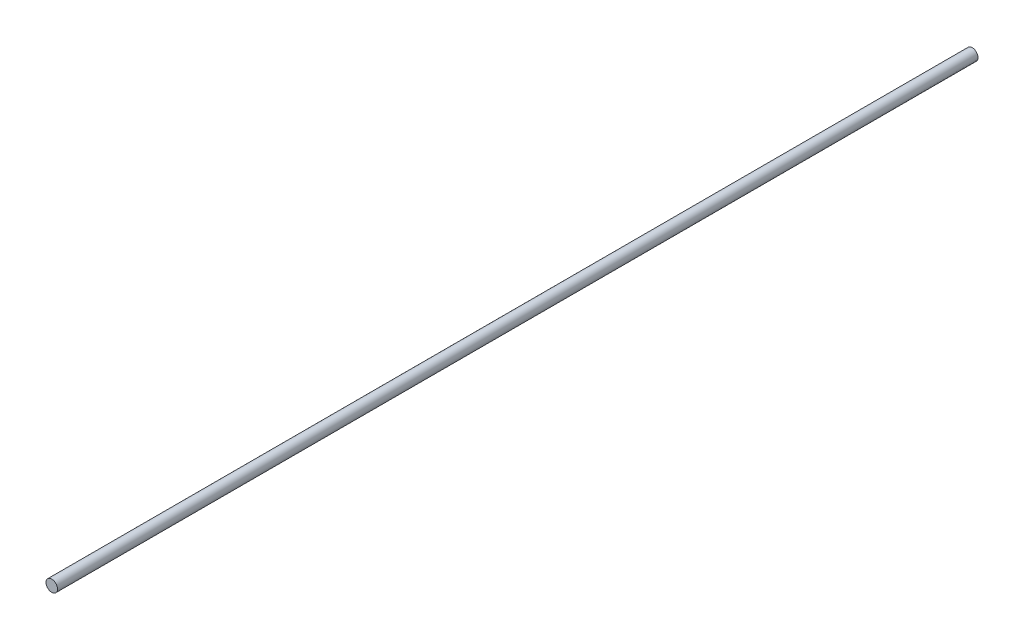
ISO-10303-21;
HEADER;
FILE_DESCRIPTION(('STEP AP214'),'2;1');
FILE_NAME('part.step','',(''),(''),'','','');
FILE_SCHEMA(('AUTOMOTIVE_DESIGN { 1 0 10303 214 1 1 1 1 }'));
ENDSEC;
DATA;
#1=APPLICATION_CONTEXT('core data for automotive mechanical design processes');
#2=APPLICATION_PROTOCOL_DEFINITION('international standard','automotive_design',2000,#1);
#3=PRODUCT_CONTEXT('',#1,'mechanical');
#4=PRODUCT('Part','Part','',(#3));
#5=PRODUCT_RELATED_PRODUCT_CATEGORY('part','',(#4));
#6=PRODUCT_DEFINITION_FORMATION('','',#4);
#7=PRODUCT_DEFINITION_CONTEXT('part definition',#1,'design');
#8=PRODUCT_DEFINITION('design','',#6,#7);
#9=PRODUCT_DEFINITION_SHAPE('','',#8);
#10=(LENGTH_UNIT() NAMED_UNIT(*) SI_UNIT(.MILLI.,.METRE.));
#11=(NAMED_UNIT(*) PLANE_ANGLE_UNIT() SI_UNIT($,.RADIAN.));
#12=(NAMED_UNIT(*) SI_UNIT($,.STERADIAN.) SOLID_ANGLE_UNIT());
#13=UNCERTAINTY_MEASURE_WITH_UNIT(LENGTH_MEASURE(1.E-05),#10,'distance_accuracy_value','');
#14=(GEOMETRIC_REPRESENTATION_CONTEXT(3) GLOBAL_UNCERTAINTY_ASSIGNED_CONTEXT((#13)) GLOBAL_UNIT_ASSIGNED_CONTEXT((#10,
#11,#12)) REPRESENTATION_CONTEXT('',''));
#15=CARTESIAN_POINT('',(0.,0.,0.));
#16=DIRECTION('',(0.,0.,1.));
#17=DIRECTION('',(1.,0.,0.));
#18=AXIS2_PLACEMENT_3D('',#15,#16,#17);
#19=CARTESIAN_POINT('',(0.,0.,-600.));
#20=DIRECTION('',(0.,0.,1.));
#21=DIRECTION('',(1.,0.,0.));
#22=AXIS2_PLACEMENT_3D('',#19,#20,#21);
#23=CYLINDRICAL_SURFACE('',#22,3.75);
#24=CARTESIAN_POINT('',(0.,0.,-600.));
#25=DIRECTION('',(0.,0.,1.));
#26=DIRECTION('',(1.,0.,0.));
#27=AXIS2_PLACEMENT_3D('',#24,#25,#26);
#28=CIRCLE('',#27,3.75);
#29=CARTESIAN_POINT('',(3.75,0.,-600.));
#30=VERTEX_POINT('',#29);
#31=EDGE_CURVE('E10',#30,#30,#28,.T.);
#32=ORIENTED_EDGE('',*,*,#31,.T.);
#33=EDGE_LOOP('',(#32));
#34=FACE_BOUND('',#33,.T.);
#35=CARTESIAN_POINT('',(0.,0.,0.));
#36=DIRECTION('',(0.,0.,1.));
#37=DIRECTION('',(1.,0.,0.));
#38=AXIS2_PLACEMENT_3D('',#35,#36,#37);
#39=CIRCLE('',#38,3.75);
#40=CARTESIAN_POINT('',(3.75,0.,0.));
#41=VERTEX_POINT('',#40);
#42=EDGE_CURVE('E37',#41,#41,#39,.T.);
#43=ORIENTED_EDGE('',*,*,#42,.F.);
#44=EDGE_LOOP('',(#43));
#45=FACE_BOUND('',#44,.T.);
#46=ADVANCED_FACE('F34',(#34,#45),#23,.T.);
#47=CARTESIAN_POINT('',(0.,0.,-600.));
#48=DIRECTION('',(0.,0.,1.));
#49=DIRECTION('',(1.,0.,0.));
#50=AXIS2_PLACEMENT_3D('',#47,#48,#49);
#51=PLANE('',#50);
#52=ORIENTED_EDGE('',*,*,#31,.F.);
#53=EDGE_LOOP('',(#52));
#54=FACE_BOUND('',#53,.T.);
#55=ADVANCED_FACE('F49',(#54),#51,.F.);
#56=CARTESIAN_POINT('',(0.,0.,0.));
#57=DIRECTION('',(0.,0.,1.));
#58=DIRECTION('',(1.,0.,0.));
#59=AXIS2_PLACEMENT_3D('',#56,#57,#58);
#60=PLANE('',#59);
#61=ORIENTED_EDGE('',*,*,#42,.T.);
#62=EDGE_LOOP('',(#61));
#63=FACE_BOUND('',#62,.T.);
#64=ADVANCED_FACE('F46',(#63),#60,.T.);
#65=CLOSED_SHELL('',(#46,#55,#64));
#66=MANIFOLD_SOLID_BREP('B2',#65);
#67=ADVANCED_BREP_SHAPE_REPRESENTATION('',(#18,#66),#14);
#68=SHAPE_DEFINITION_REPRESENTATION(#9,#67);
ENDSEC;
END-ISO-10303-21;
